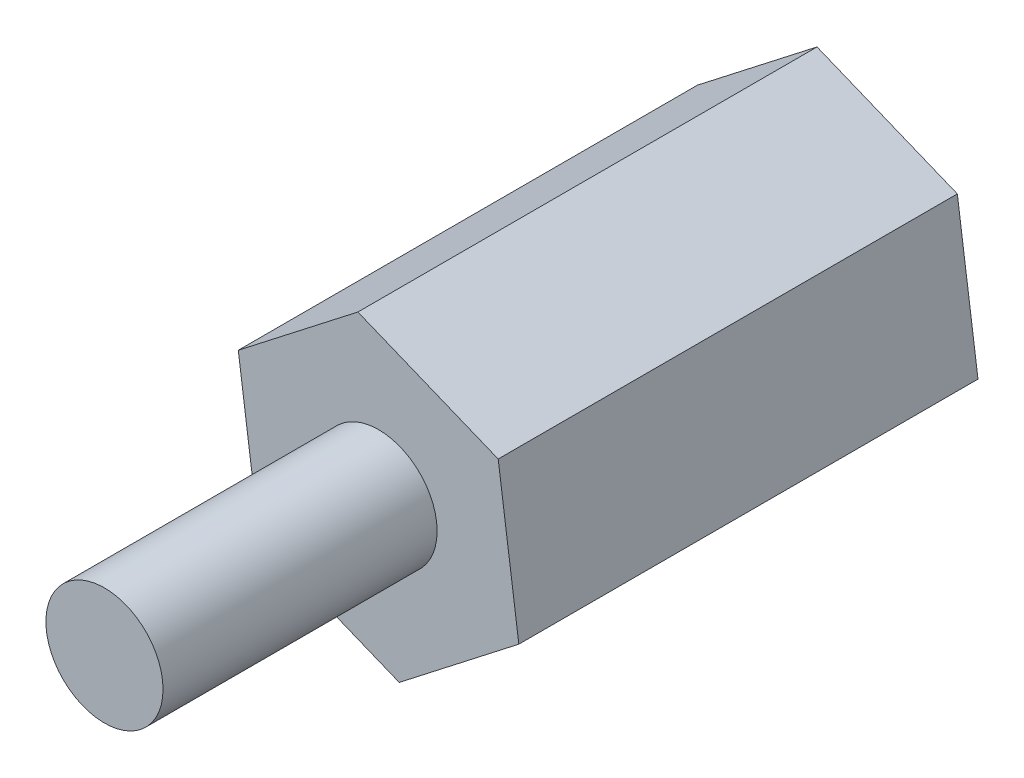
ISO-10303-21;
HEADER;
FILE_DESCRIPTION(('STEP AP214'),'2;1');
FILE_NAME('part.step','',(''),(''),'','','');
FILE_SCHEMA(('AUTOMOTIVE_DESIGN { 1 0 10303 214 1 1 1 1 }'));
ENDSEC;
DATA;
#1=APPLICATION_CONTEXT('core data for automotive mechanical design processes');
#2=APPLICATION_PROTOCOL_DEFINITION('international standard','automotive_design',2000,#1);
#3=PRODUCT_CONTEXT('',#1,'mechanical');
#4=PRODUCT('Part','Part','',(#3));
#5=PRODUCT_RELATED_PRODUCT_CATEGORY('part','',(#4));
#6=PRODUCT_DEFINITION_FORMATION('','',#4);
#7=PRODUCT_DEFINITION_CONTEXT('part definition',#1,'design');
#8=PRODUCT_DEFINITION('design','',#6,#7);
#9=PRODUCT_DEFINITION_SHAPE('','',#8);
#10=(LENGTH_UNIT() NAMED_UNIT(*) SI_UNIT(.MILLI.,.METRE.));
#11=(NAMED_UNIT(*) PLANE_ANGLE_UNIT() SI_UNIT($,.RADIAN.));
#12=(NAMED_UNIT(*) SI_UNIT($,.STERADIAN.) SOLID_ANGLE_UNIT());
#13=UNCERTAINTY_MEASURE_WITH_UNIT(LENGTH_MEASURE(1.E-05),#10,'distance_accuracy_value','');
#14=(GEOMETRIC_REPRESENTATION_CONTEXT(3) GLOBAL_UNCERTAINTY_ASSIGNED_CONTEXT((#13)) GLOBAL_UNIT_ASSIGNED_CONTEXT((#10,
#11,#12)) REPRESENTATION_CONTEXT('',''));
#15=CARTESIAN_POINT('',(0.,0.,0.));
#16=DIRECTION('',(0.,0.,1.));
#17=DIRECTION('',(1.,0.,0.));
#18=AXIS2_PLACEMENT_3D('',#15,#16,#17);
#19=CARTESIAN_POINT('',(0.,0.,9.9568));
#20=DIRECTION('',(0.,0.,1.));
#21=DIRECTION('',(1.,0.,0.));
#22=AXIS2_PLACEMENT_3D('',#19,#20,#21);
#23=PLANE('',#22);
#24=DIRECTION('',(0.136399435928584,-0.990653922355514,0.));
#25=VECTOR('',#24,1.);
#26=CARTESIAN_POINT('',(-3.04224099250596,1.23906650219018,9.9568));
#27=LINE('',#26,#25);
#28=CARTESIAN_POINT('',(-3.04224099250596,1.23906650219018,9.9568));
#29=VERTEX_POINT('',#28);
#30=CARTESIAN_POINT('',(-2.594183564128,-2.01512473284946,9.9568));
#31=VERTEX_POINT('',#30);
#32=EDGE_CURVE('E131',#29,#31,#27,.T.);
#33=ORIENTED_EDGE('',*,*,#32,.T.);
#34=DIRECTION('',(0.926131181082863,-0.377201584601736,0.));
#35=VECTOR('',#34,1.);
#36=CARTESIAN_POINT('',(-2.594183564128,-2.01512473284946,9.9568));
#37=LINE('',#36,#35);
#38=CARTESIAN_POINT('',(0.448057428377955,-3.25419123503964,9.9568));
#39=VERTEX_POINT('',#38);
#40=EDGE_CURVE('E89',#31,#39,#37,.T.);
#41=ORIENTED_EDGE('',*,*,#40,.T.);
#42=DIRECTION('',(0.789731745154278,0.61345233775378,0.));
#43=VECTOR('',#42,1.);
#44=CARTESIAN_POINT('',(0.448057428377955,-3.25419123503964,9.9568));
#45=LINE('',#44,#43);
#46=CARTESIAN_POINT('',(3.04224099250594,-1.23906650219019,9.9568));
#47=VERTEX_POINT('',#46);
#48=EDGE_CURVE('E102',#39,#47,#45,.T.);
#49=ORIENTED_EDGE('',*,*,#48,.T.);
#50=DIRECTION('',(-0.136399435928583,0.990653922355514,0.));
#51=VECTOR('',#50,1.);
#52=CARTESIAN_POINT('',(3.04224099250594,-1.23906650219019,9.9568));
#53=LINE('',#52,#51);
#54=CARTESIAN_POINT('',(2.59418356412798,2.01512473284946,9.9568));
#55=VERTEX_POINT('',#54);
#56=EDGE_CURVE('E96',#47,#55,#53,.T.);
#57=ORIENTED_EDGE('',*,*,#56,.T.);
#58=DIRECTION('',(-0.926131181082863,0.377201584601736,0.));
#59=VECTOR('',#58,1.);
#60=CARTESIAN_POINT('',(2.59418356412798,2.01512473284946,9.9568));
#61=LINE('',#60,#59);
#62=CARTESIAN_POINT('',(-0.448057428377956,3.25419123503964,9.9568));
#63=VERTEX_POINT('',#62);
#64=EDGE_CURVE('E100',#55,#63,#61,.T.);
#65=ORIENTED_EDGE('',*,*,#64,.T.);
#66=DIRECTION('',(-0.78973174515428,-0.613452337753778,0.));
#67=VECTOR('',#66,1.);
#68=CARTESIAN_POINT('',(-0.448057428377956,3.25419123503964,9.9568));
#69=LINE('',#68,#67);
#70=EDGE_CURVE('E52',#63,#29,#69,.T.);
#71=ORIENTED_EDGE('',*,*,#70,.T.);
#72=EDGE_LOOP('',(#33,#41,#49,#57,#65,#71));
#73=FACE_BOUND('',#72,.T.);
#74=CARTESIAN_POINT('',(0.,0.,9.9568));
#75=DIRECTION('',(0.,0.,1.));
#76=DIRECTION('',(1.,0.,0.));
#77=AXIS2_PLACEMENT_3D('',#74,#75,#76);
#78=CIRCLE('',#77,1.27);
#79=CARTESIAN_POINT('',(1.27,0.,9.9568));
#80=VERTEX_POINT('',#79);
#81=EDGE_CURVE('E182',#80,#80,#78,.T.);
#82=ORIENTED_EDGE('',*,*,#81,.F.);
#83=EDGE_LOOP('',(#82));
#84=FACE_BOUND('',#83,.T.);
#85=ADVANCED_FACE('F35',(#73,#84),#23,.T.);
#86=CARTESIAN_POINT('',(-3.04224099250596,1.23906650219018,9.9568));
#87=DIRECTION('',(0.990653922355514,0.136399435928584,0.));
#88=DIRECTION('',(-0.136399435928584,0.990653922355514,0.));
#89=AXIS2_PLACEMENT_3D('',#86,#87,#88);
#90=PLANE('',#89);
#91=DIRECTION('',(0.136399435928584,-0.990653922355514,0.));
#92=VECTOR('',#91,1.);
#93=CARTESIAN_POINT('',(-3.04224099250596,1.23906650219018,0.));
#94=LINE('',#93,#92);
#95=CARTESIAN_POINT('',(-3.04224099250596,1.23906650219018,0.));
#96=VERTEX_POINT('',#95);
#97=CARTESIAN_POINT('',(-2.594183564128,-2.01512473284946,0.));
#98=VERTEX_POINT('',#97);
#99=EDGE_CURVE('E120',#96,#98,#94,.T.);
#100=ORIENTED_EDGE('',*,*,#99,.T.);
#101=DIRECTION('',(0.,0.,-1.));
#102=VECTOR('',#101,1.);
#103=CARTESIAN_POINT('',(-2.594183564128,-2.01512473284946,9.9568));
#104=LINE('',#103,#102);
#105=EDGE_CURVE('E11',#31,#98,#104,.T.);
#106=ORIENTED_EDGE('',*,*,#105,.F.);
#107=ORIENTED_EDGE('',*,*,#32,.F.);
#108=DIRECTION('',(0.,0.,-1.));
#109=VECTOR('',#108,1.);
#110=CARTESIAN_POINT('',(-3.04224099250596,1.23906650219018,9.9568));
#111=LINE('',#110,#109);
#112=EDGE_CURVE('E116',#29,#96,#111,.T.);
#113=ORIENTED_EDGE('',*,*,#112,.T.);
#114=EDGE_LOOP('',(#100,#106,#107,#113));
#115=FACE_BOUND('',#114,.T.);
#116=ADVANCED_FACE('F37',(#115),#90,.F.);
#117=CARTESIAN_POINT('',(-2.594183564128,-2.01512473284946,9.9568));
#118=DIRECTION('',(0.377201584601736,0.926131181082864,0.));
#119=DIRECTION('',(-0.926131181082864,0.377201584601736,0.));
#120=AXIS2_PLACEMENT_3D('',#117,#118,#119);
#121=PLANE('',#120);
#122=DIRECTION('',(0.926131181082863,-0.377201584601736,0.));
#123=VECTOR('',#122,1.);
#124=CARTESIAN_POINT('',(-2.594183564128,-2.01512473284946,0.));
#125=LINE('',#124,#123);
#126=CARTESIAN_POINT('',(0.448057428377955,-3.25419123503964,0.));
#127=VERTEX_POINT('',#126);
#128=EDGE_CURVE('E123',#98,#127,#125,.T.);
#129=ORIENTED_EDGE('',*,*,#128,.T.);
#130=DIRECTION('',(0.,0.,-1.));
#131=VECTOR('',#130,1.);
#132=CARTESIAN_POINT('',(0.448057428377955,-3.25419123503964,9.9568));
#133=LINE('',#132,#131);
#134=EDGE_CURVE('E44',#39,#127,#133,.T.);
#135=ORIENTED_EDGE('',*,*,#134,.F.);
#136=ORIENTED_EDGE('',*,*,#40,.F.);
#137=ORIENTED_EDGE('',*,*,#105,.T.);
#138=EDGE_LOOP('',(#129,#135,#136,#137));
#139=FACE_BOUND('',#138,.T.);
#140=ADVANCED_FACE('F160',(#139),#121,.F.);
#141=CARTESIAN_POINT('',(0.448057428377955,-3.25419123503964,9.9568));
#142=DIRECTION('',(-0.61345233775378,0.789731745154278,0.));
#143=DIRECTION('',(-0.789731745154278,-0.61345233775378,0.));
#144=AXIS2_PLACEMENT_3D('',#141,#142,#143);
#145=PLANE('',#144);
#146=DIRECTION('',(0.789731745154278,0.61345233775378,0.));
#147=VECTOR('',#146,1.);
#148=CARTESIAN_POINT('',(0.448057428377955,-3.25419123503964,0.));
#149=LINE('',#148,#147);
#150=CARTESIAN_POINT('',(3.04224099250594,-1.23906650219019,0.));
#151=VERTEX_POINT('',#150);
#152=EDGE_CURVE('E126',#127,#151,#149,.T.);
#153=ORIENTED_EDGE('',*,*,#152,.T.);
#154=DIRECTION('',(0.,0.,-1.));
#155=VECTOR('',#154,1.);
#156=CARTESIAN_POINT('',(3.04224099250594,-1.23906650219019,9.9568));
#157=LINE('',#156,#155);
#158=EDGE_CURVE('E111',#47,#151,#157,.T.);
#159=ORIENTED_EDGE('',*,*,#158,.F.);
#160=ORIENTED_EDGE('',*,*,#48,.F.);
#161=ORIENTED_EDGE('',*,*,#134,.T.);
#162=EDGE_LOOP('',(#153,#159,#160,#161));
#163=FACE_BOUND('',#162,.T.);
#164=ADVANCED_FACE('F137',(#163),#145,.F.);
#165=CARTESIAN_POINT('',(3.04224099250594,-1.23906650219019,9.9568));
#166=DIRECTION('',(-0.990653922355514,-0.136399435928583,0.));
#167=DIRECTION('',(0.136399435928583,-0.990653922355514,0.));
#168=AXIS2_PLACEMENT_3D('',#165,#166,#167);
#169=PLANE('',#168);
#170=DIRECTION('',(-0.136399435928583,0.990653922355514,0.));
#171=VECTOR('',#170,1.);
#172=CARTESIAN_POINT('',(3.04224099250594,-1.23906650219019,0.));
#173=LINE('',#172,#171);
#174=CARTESIAN_POINT('',(2.59418356412798,2.01512473284946,0.));
#175=VERTEX_POINT('',#174);
#176=EDGE_CURVE('E110',#151,#175,#173,.T.);
#177=ORIENTED_EDGE('',*,*,#176,.T.);
#178=DIRECTION('',(0.,0.,-1.));
#179=VECTOR('',#178,1.);
#180=CARTESIAN_POINT('',(2.59418356412798,2.01512473284946,9.9568));
#181=LINE('',#180,#179);
#182=EDGE_CURVE('E107',#55,#175,#181,.T.);
#183=ORIENTED_EDGE('',*,*,#182,.F.);
#184=ORIENTED_EDGE('',*,*,#56,.F.);
#185=ORIENTED_EDGE('',*,*,#158,.T.);
#186=EDGE_LOOP('',(#177,#183,#184,#185));
#187=FACE_BOUND('',#186,.T.);
#188=ADVANCED_FACE('F108',(#187),#169,.F.);
#189=CARTESIAN_POINT('',(2.59418356412798,2.01512473284946,9.9568));
#190=DIRECTION('',(-0.377201584601736,-0.926131181082863,0.));
#191=DIRECTION('',(0.926131181082863,-0.377201584601736,0.));
#192=AXIS2_PLACEMENT_3D('',#189,#190,#191);
#193=PLANE('',#192);
#194=DIRECTION('',(-0.926131181082863,0.377201584601736,0.));
#195=VECTOR('',#194,1.);
#196=CARTESIAN_POINT('',(2.59418356412798,2.01512473284946,0.));
#197=LINE('',#196,#195);
#198=CARTESIAN_POINT('',(-0.448057428377956,3.25419123503964,0.));
#199=VERTEX_POINT('',#198);
#200=EDGE_CURVE('E75',#175,#199,#197,.T.);
#201=ORIENTED_EDGE('',*,*,#200,.T.);
#202=DIRECTION('',(0.,0.,-1.));
#203=VECTOR('',#202,1.);
#204=CARTESIAN_POINT('',(-0.448057428377956,3.25419123503964,9.9568));
#205=LINE('',#204,#203);
#206=EDGE_CURVE('E112',#63,#199,#205,.T.);
#207=ORIENTED_EDGE('',*,*,#206,.F.);
#208=ORIENTED_EDGE('',*,*,#64,.F.);
#209=ORIENTED_EDGE('',*,*,#182,.T.);
#210=EDGE_LOOP('',(#201,#207,#208,#209));
#211=FACE_BOUND('',#210,.T.);
#212=ADVANCED_FACE('F114',(#211),#193,.F.);
#213=CARTESIAN_POINT('',(-0.448057428377956,3.25419123503964,9.9568));
#214=DIRECTION('',(0.613452337753778,-0.78973174515428,0.));
#215=DIRECTION('',(0.78973174515428,0.613452337753778,0.));
#216=AXIS2_PLACEMENT_3D('',#213,#214,#215);
#217=PLANE('',#216);
#218=DIRECTION('',(-0.78973174515428,-0.613452337753778,0.));
#219=VECTOR('',#218,1.);
#220=CARTESIAN_POINT('',(-0.448057428377956,3.25419123503964,0.));
#221=LINE('',#220,#219);
#222=EDGE_CURVE('E81',#199,#96,#221,.T.);
#223=ORIENTED_EDGE('',*,*,#222,.T.);
#224=ORIENTED_EDGE('',*,*,#112,.F.);
#225=ORIENTED_EDGE('',*,*,#70,.F.);
#226=ORIENTED_EDGE('',*,*,#206,.T.);
#227=EDGE_LOOP('',(#223,#224,#225,#226));
#228=FACE_BOUND('',#227,.T.);
#229=ADVANCED_FACE('F144',(#228),#217,.F.);
#230=CARTESIAN_POINT('',(0.,0.,0.));
#231=DIRECTION('',(0.,0.,1.));
#232=DIRECTION('',(1.,0.,0.));
#233=AXIS2_PLACEMENT_3D('',#230,#231,#232);
#234=PLANE('',#233);
#235=CARTESIAN_POINT('',(0.,0.,0.));
#236=DIRECTION('',(0.,0.,-1.));
#237=DIRECTION('',(-1.,0.,0.));
#238=AXIS2_PLACEMENT_3D('',#235,#236,#237);
#239=CIRCLE('',#238,1.27);
#240=CARTESIAN_POINT('',(-1.27,0.,0.));
#241=VERTEX_POINT('',#240);
#242=EDGE_CURVE('E181',#241,#241,#239,.T.);
#243=ORIENTED_EDGE('',*,*,#242,.F.);
#244=EDGE_LOOP('',(#243));
#245=FACE_BOUND('',#244,.T.);
#246=ORIENTED_EDGE('',*,*,#99,.F.);
#247=ORIENTED_EDGE('',*,*,#222,.F.);
#248=ORIENTED_EDGE('',*,*,#200,.F.);
#249=ORIENTED_EDGE('',*,*,#176,.F.);
#250=ORIENTED_EDGE('',*,*,#152,.F.);
#251=ORIENTED_EDGE('',*,*,#128,.F.);
#252=EDGE_LOOP('',(#246,#247,#248,#249,#250,#251));
#253=FACE_BOUND('',#252,.T.);
#254=ADVANCED_FACE('F140',(#245,#253),#234,.F.);
#255=CARTESIAN_POINT('',(0.,0.,7.4168));
#256=DIRECTION('',(0.,0.,-1.));
#257=DIRECTION('',(-1.,0.,0.));
#258=AXIS2_PLACEMENT_3D('',#255,#256,#257);
#259=CYLINDRICAL_SURFACE('',#258,1.27);
#260=CARTESIAN_POINT('',(0.,0.,7.4168));
#261=DIRECTION('',(0.,0.,-1.));
#262=DIRECTION('',(-1.,0.,0.));
#263=AXIS2_PLACEMENT_3D('',#260,#261,#262);
#264=CIRCLE('',#263,1.27);
#265=CARTESIAN_POINT('',(-1.27,0.,7.4168));
#266=VERTEX_POINT('',#265);
#267=EDGE_CURVE('E124',#266,#266,#264,.T.);
#268=ORIENTED_EDGE('',*,*,#267,.F.);
#269=EDGE_LOOP('',(#268));
#270=FACE_BOUND('',#269,.T.);
#271=ORIENTED_EDGE('',*,*,#242,.T.);
#272=EDGE_LOOP('',(#271));
#273=FACE_BOUND('',#272,.T.);
#274=ADVANCED_FACE('F151',(#270,#273),#259,.F.);
#275=CARTESIAN_POINT('',(0.,0.,7.4168));
#276=DIRECTION('',(0.,0.,-1.));
#277=DIRECTION('',(-1.,0.,0.));
#278=AXIS2_PLACEMENT_3D('',#275,#276,#277);
#279=PLANE('',#278);
#280=ORIENTED_EDGE('',*,*,#267,.T.);
#281=EDGE_LOOP('',(#280));
#282=FACE_BOUND('',#281,.T.);
#283=ADVANCED_FACE('F164',(#282),#279,.T.);
#284=CARTESIAN_POINT('',(0.,0.,15.9004));
#285=DIRECTION('',(0.,0.,-1.));
#286=DIRECTION('',(-1.,0.,0.));
#287=AXIS2_PLACEMENT_3D('',#284,#285,#286);
#288=CYLINDRICAL_SURFACE('',#287,1.27);
#289=CARTESIAN_POINT('',(0.,0.,15.9004));
#290=DIRECTION('',(0.,0.,1.));
#291=DIRECTION('',(1.,0.,0.));
#292=AXIS2_PLACEMENT_3D('',#289,#290,#291);
#293=CIRCLE('',#292,1.27);
#294=CARTESIAN_POINT('',(1.27,0.,15.9004));
#295=VERTEX_POINT('',#294);
#296=EDGE_CURVE('E180',#295,#295,#293,.T.);
#297=ORIENTED_EDGE('',*,*,#296,.F.);
#298=EDGE_LOOP('',(#297));
#299=FACE_BOUND('',#298,.T.);
#300=ORIENTED_EDGE('',*,*,#81,.T.);
#301=EDGE_LOOP('',(#300));
#302=FACE_BOUND('',#301,.T.);
#303=ADVANCED_FACE('F168',(#299,#302),#288,.T.);
#304=CARTESIAN_POINT('',(0.,0.,15.9004));
#305=DIRECTION('',(0.,0.,1.));
#306=DIRECTION('',(1.,0.,0.));
#307=AXIS2_PLACEMENT_3D('',#304,#305,#306);
#308=PLANE('',#307);
#309=ORIENTED_EDGE('',*,*,#296,.T.);
#310=EDGE_LOOP('',(#309));
#311=FACE_BOUND('',#310,.T.);
#312=ADVANCED_FACE('F172',(#311),#308,.T.);
#313=CLOSED_SHELL('',(#85,#116,#140,#164,#188,#212,#229,#254,#274,#283,#303,#312));
#314=MANIFOLD_SOLID_BREP('B2',#313);
#315=ADVANCED_BREP_SHAPE_REPRESENTATION('',(#18,#314),#14);
#316=SHAPE_DEFINITION_REPRESENTATION(#9,#315);
ENDSEC;
END-ISO-10303-21;
